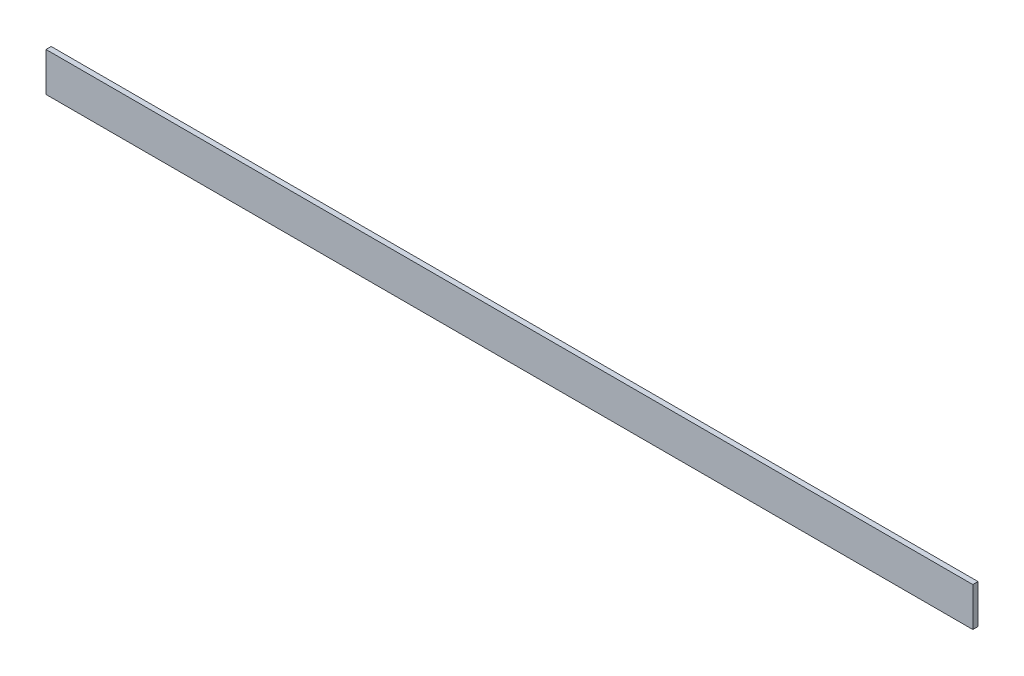
ISO-10303-21;
HEADER;
FILE_DESCRIPTION(('STEP AP214'),'2;1');
FILE_NAME('part.step','',(''),(''),'','','');
FILE_SCHEMA(('AUTOMOTIVE_DESIGN { 1 0 10303 214 1 1 1 1 }'));
ENDSEC;
DATA;
#1=APPLICATION_CONTEXT('core data for automotive mechanical design processes');
#2=APPLICATION_PROTOCOL_DEFINITION('international standard','automotive_design',2000,#1);
#3=PRODUCT_CONTEXT('',#1,'mechanical');
#4=PRODUCT('Part','Part','',(#3));
#5=PRODUCT_RELATED_PRODUCT_CATEGORY('part','',(#4));
#6=PRODUCT_DEFINITION_FORMATION('','',#4);
#7=PRODUCT_DEFINITION_CONTEXT('part definition',#1,'design');
#8=PRODUCT_DEFINITION('design','',#6,#7);
#9=PRODUCT_DEFINITION_SHAPE('','',#8);
#10=(LENGTH_UNIT() NAMED_UNIT(*) SI_UNIT(.MILLI.,.METRE.));
#11=(NAMED_UNIT(*) PLANE_ANGLE_UNIT() SI_UNIT($,.RADIAN.));
#12=(NAMED_UNIT(*) SI_UNIT($,.STERADIAN.) SOLID_ANGLE_UNIT());
#13=UNCERTAINTY_MEASURE_WITH_UNIT(LENGTH_MEASURE(1.E-05),#10,'distance_accuracy_value','');
#14=(GEOMETRIC_REPRESENTATION_CONTEXT(3) GLOBAL_UNCERTAINTY_ASSIGNED_CONTEXT((#13)) GLOBAL_UNIT_ASSIGNED_CONTEXT((#10,
#11,#12)) REPRESENTATION_CONTEXT('',''));
#15=CARTESIAN_POINT('',(0.,0.,0.));
#16=DIRECTION('',(0.,0.,1.));
#17=DIRECTION('',(1.,0.,0.));
#18=AXIS2_PLACEMENT_3D('',#15,#16,#17);
#19=CARTESIAN_POINT('',(356.76,-15.,4.));
#20=DIRECTION('',(-1.,0.,0.));
#21=DIRECTION('',(0.,0.,1.));
#22=AXIS2_PLACEMENT_3D('',#19,#20,#21);
#23=PLANE('',#22);
#24=DIRECTION('',(0.,1.,0.));
#25=VECTOR('',#24,1.);
#26=CARTESIAN_POINT('',(356.76,-15.,0.));
#27=LINE('',#26,#25);
#28=CARTESIAN_POINT('',(356.76,-15.,0.));
#29=VERTEX_POINT('',#28);
#30=CARTESIAN_POINT('',(356.76,15.,0.));
#31=VERTEX_POINT('',#30);
#32=EDGE_CURVE('E93',#29,#31,#27,.T.);
#33=ORIENTED_EDGE('',*,*,#32,.T.);
#34=DIRECTION('',(0.,0.,-1.));
#35=VECTOR('',#34,1.);
#36=CARTESIAN_POINT('',(356.76,15.,4.));
#37=LINE('',#36,#35);
#38=CARTESIAN_POINT('',(356.76,15.,4.));
#39=VERTEX_POINT('',#38);
#40=EDGE_CURVE('E11',#39,#31,#37,.T.);
#41=ORIENTED_EDGE('',*,*,#40,.F.);
#42=DIRECTION('',(0.,1.,0.));
#43=VECTOR('',#42,1.);
#44=CARTESIAN_POINT('',(356.76,-15.,4.));
#45=LINE('',#44,#43);
#46=CARTESIAN_POINT('',(356.76,-15.,4.));
#47=VERTEX_POINT('',#46);
#48=EDGE_CURVE('E81',#47,#39,#45,.T.);
#49=ORIENTED_EDGE('',*,*,#48,.F.);
#50=DIRECTION('',(0.,0.,-1.));
#51=VECTOR('',#50,1.);
#52=CARTESIAN_POINT('',(356.76,-15.,4.));
#53=LINE('',#52,#51);
#54=EDGE_CURVE('E89',#47,#29,#53,.T.);
#55=ORIENTED_EDGE('',*,*,#54,.T.);
#56=EDGE_LOOP('',(#33,#41,#49,#55));
#57=FACE_BOUND('',#56,.T.);
#58=ADVANCED_FACE('F30',(#57),#23,.F.);
#59=CARTESIAN_POINT('',(-356.76,15.000000000001,4.));
#60=DIRECTION('',(0.,-1.,0.));
#61=DIRECTION('',(0.,0.,-1.));
#62=AXIS2_PLACEMENT_3D('',#59,#60,#61);
#63=PLANE('',#62);
#64=DIRECTION('',(-1.,0.,0.));
#65=VECTOR('',#64,1.);
#66=CARTESIAN_POINT('',(-356.76,15.000000000001,0.));
#67=LINE('',#66,#65);
#68=CARTESIAN_POINT('',(-356.76,15.000000000001,0.));
#69=VERTEX_POINT('',#68);
#70=EDGE_CURVE('E85',#31,#69,#67,.T.);
#71=ORIENTED_EDGE('',*,*,#70,.T.);
#72=DIRECTION('',(0.,0.,-1.));
#73=VECTOR('',#72,1.);
#74=CARTESIAN_POINT('',(-356.76,15.000000000001,4.));
#75=LINE('',#74,#73);
#76=CARTESIAN_POINT('',(-356.76,15.000000000001,4.));
#77=VERTEX_POINT('',#76);
#78=EDGE_CURVE('E38',#77,#69,#75,.T.);
#79=ORIENTED_EDGE('',*,*,#78,.F.);
#80=DIRECTION('',(-1.,0.,0.));
#81=VECTOR('',#80,1.);
#82=CARTESIAN_POINT('',(-356.76,15.000000000001,4.));
#83=LINE('',#82,#81);
#84=EDGE_CURVE('E76',#39,#77,#83,.T.);
#85=ORIENTED_EDGE('',*,*,#84,.F.);
#86=ORIENTED_EDGE('',*,*,#40,.T.);
#87=EDGE_LOOP('',(#71,#79,#85,#86));
#88=FACE_BOUND('',#87,.T.);
#89=ADVANCED_FACE('F84',(#88),#63,.F.);
#90=CARTESIAN_POINT('',(-356.76,-14.999999999999,4.));
#91=DIRECTION('',(1.,0.,0.));
#92=DIRECTION('',(0.,0.,-1.));
#93=AXIS2_PLACEMENT_3D('',#90,#91,#92);
#94=PLANE('',#93);
#95=DIRECTION('',(0.,-1.,0.));
#96=VECTOR('',#95,1.);
#97=CARTESIAN_POINT('',(-356.76,-14.999999999999,0.));
#98=LINE('',#97,#96);
#99=CARTESIAN_POINT('',(-356.76,-14.999999999999,0.));
#100=VERTEX_POINT('',#99);
#101=EDGE_CURVE('E63',#69,#100,#98,.T.);
#102=ORIENTED_EDGE('',*,*,#101,.T.);
#103=DIRECTION('',(0.,0.,-1.));
#104=VECTOR('',#103,1.);
#105=CARTESIAN_POINT('',(-356.76,-14.999999999999,4.));
#106=LINE('',#105,#104);
#107=CARTESIAN_POINT('',(-356.76,-14.999999999999,4.));
#108=VERTEX_POINT('',#107);
#109=EDGE_CURVE('E86',#108,#100,#106,.T.);
#110=ORIENTED_EDGE('',*,*,#109,.F.);
#111=DIRECTION('',(0.,-1.,0.));
#112=VECTOR('',#111,1.);
#113=CARTESIAN_POINT('',(-356.76,-14.999999999999,4.));
#114=LINE('',#113,#112);
#115=EDGE_CURVE('E79',#77,#108,#114,.T.);
#116=ORIENTED_EDGE('',*,*,#115,.F.);
#117=ORIENTED_EDGE('',*,*,#78,.T.);
#118=EDGE_LOOP('',(#102,#110,#116,#117));
#119=FACE_BOUND('',#118,.T.);
#120=ADVANCED_FACE('F87',(#119),#94,.F.);
#121=CARTESIAN_POINT('',(-356.76,-14.999999999999,4.));
#122=DIRECTION('',(0.,1.,0.));
#123=DIRECTION('',(0.,0.,1.));
#124=AXIS2_PLACEMENT_3D('',#121,#122,#123);
#125=PLANE('',#124);
#126=DIRECTION('',(1.,0.,0.));
#127=VECTOR('',#126,1.);
#128=CARTESIAN_POINT('',(-356.76,-14.999999999999,0.));
#129=LINE('',#128,#127);
#130=EDGE_CURVE('E69',#100,#29,#129,.T.);
#131=ORIENTED_EDGE('',*,*,#130,.T.);
#132=ORIENTED_EDGE('',*,*,#54,.F.);
#133=DIRECTION('',(1.,0.,0.));
#134=VECTOR('',#133,1.);
#135=CARTESIAN_POINT('',(-356.76,-14.999999999999,4.));
#136=LINE('',#135,#134);
#137=EDGE_CURVE('E46',#108,#47,#136,.T.);
#138=ORIENTED_EDGE('',*,*,#137,.F.);
#139=ORIENTED_EDGE('',*,*,#109,.T.);
#140=EDGE_LOOP('',(#131,#132,#138,#139));
#141=FACE_BOUND('',#140,.T.);
#142=ADVANCED_FACE('F100',(#141),#125,.F.);
#143=CARTESIAN_POINT('',(0.,0.,4.));
#144=DIRECTION('',(0.,0.,-1.));
#145=DIRECTION('',(-1.,0.,0.));
#146=AXIS2_PLACEMENT_3D('',#143,#144,#145);
#147=PLANE('',#146);
#148=ORIENTED_EDGE('',*,*,#48,.T.);
#149=ORIENTED_EDGE('',*,*,#84,.T.);
#150=ORIENTED_EDGE('',*,*,#115,.T.);
#151=ORIENTED_EDGE('',*,*,#137,.T.);
#152=EDGE_LOOP('',(#148,#149,#150,#151));
#153=FACE_BOUND('',#152,.T.);
#154=ADVANCED_FACE('F77',(#153),#147,.F.);
#155=CARTESIAN_POINT('',(0.,0.,0.));
#156=DIRECTION('',(0.,0.,-1.));
#157=DIRECTION('',(-1.,0.,0.));
#158=AXIS2_PLACEMENT_3D('',#155,#156,#157);
#159=PLANE('',#158);
#160=ORIENTED_EDGE('',*,*,#32,.F.);
#161=ORIENTED_EDGE('',*,*,#130,.F.);
#162=ORIENTED_EDGE('',*,*,#101,.F.);
#163=ORIENTED_EDGE('',*,*,#70,.F.);
#164=EDGE_LOOP('',(#160,#161,#162,#163));
#165=FACE_BOUND('',#164,.T.);
#166=ADVANCED_FACE('F103',(#165),#159,.T.);
#167=CLOSED_SHELL('',(#58,#89,#120,#142,#154,#166));
#168=MANIFOLD_SOLID_BREP('B2',#167);
#169=ADVANCED_BREP_SHAPE_REPRESENTATION('',(#18,#168),#14);
#170=SHAPE_DEFINITION_REPRESENTATION(#9,#169);
ENDSEC;
END-ISO-10303-21;
